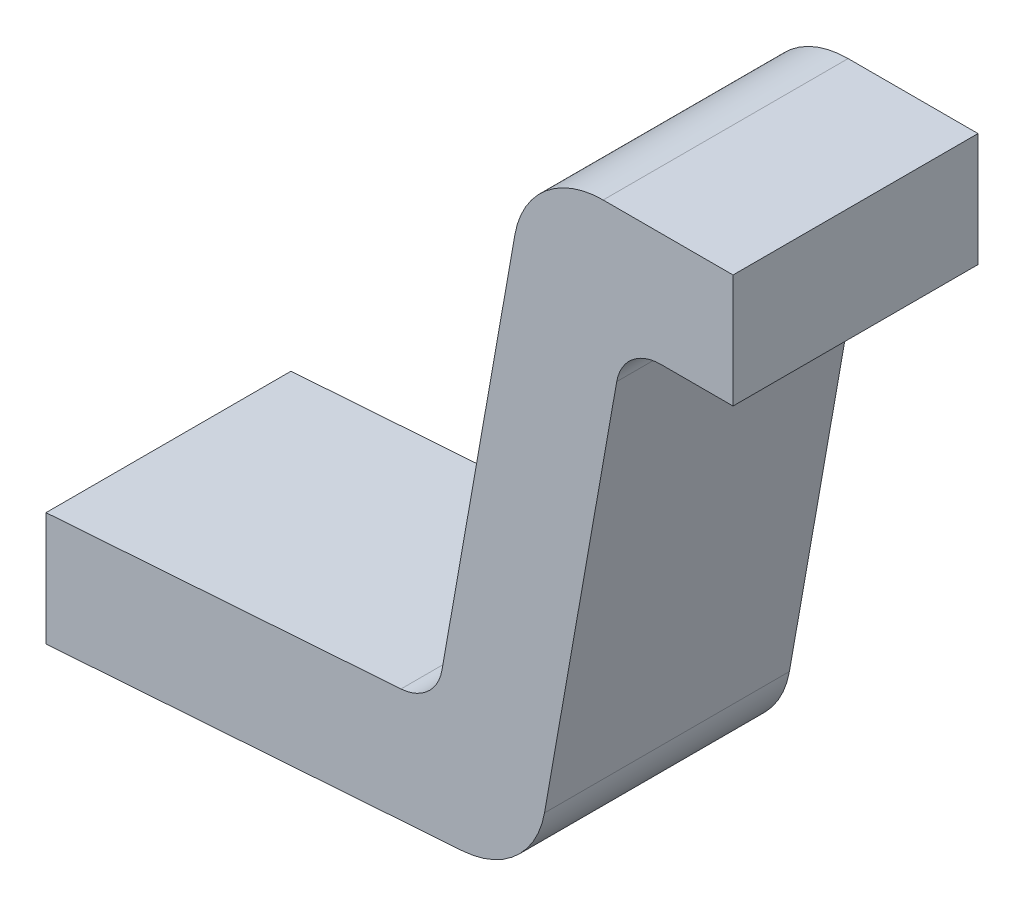
ISO-10303-21;
HEADER;
FILE_DESCRIPTION(('STEP AP214'),'2;1');
FILE_NAME('part.step','',(''),(''),'','','');
FILE_SCHEMA(('AUTOMOTIVE_DESIGN { 1 0 10303 214 1 1 1 1 }'));
ENDSEC;
DATA;
#1=APPLICATION_CONTEXT('core data for automotive mechanical design processes');
#2=APPLICATION_PROTOCOL_DEFINITION('international standard','automotive_design',2000,#1);
#3=PRODUCT_CONTEXT('',#1,'mechanical');
#4=PRODUCT('Part','Part','',(#3));
#5=PRODUCT_RELATED_PRODUCT_CATEGORY('part','',(#4));
#6=PRODUCT_DEFINITION_FORMATION('','',#4);
#7=PRODUCT_DEFINITION_CONTEXT('part definition',#1,'design');
#8=PRODUCT_DEFINITION('design','',#6,#7);
#9=PRODUCT_DEFINITION_SHAPE('','',#8);
#10=(LENGTH_UNIT() NAMED_UNIT(*) SI_UNIT(.MILLI.,.METRE.));
#11=(NAMED_UNIT(*) PLANE_ANGLE_UNIT() SI_UNIT($,.RADIAN.));
#12=(NAMED_UNIT(*) SI_UNIT($,.STERADIAN.) SOLID_ANGLE_UNIT());
#13=UNCERTAINTY_MEASURE_WITH_UNIT(LENGTH_MEASURE(1.E-05),#10,'distance_accuracy_value','');
#14=(GEOMETRIC_REPRESENTATION_CONTEXT(3) GLOBAL_UNCERTAINTY_ASSIGNED_CONTEXT((#13)) GLOBAL_UNIT_ASSIGNED_CONTEXT((#10,
#11,#12)) REPRESENTATION_CONTEXT('',''));
#15=CARTESIAN_POINT('',(0.,0.,0.));
#16=DIRECTION('',(0.,0.,1.));
#17=DIRECTION('',(1.,0.,0.));
#18=AXIS2_PLACEMENT_3D('',#15,#16,#17);
#19=CARTESIAN_POINT('',(0.657250080214,0.470646116994,0.41));
#20=DIRECTION('',(0.,0.,1.));
#21=DIRECTION('',(1.,0.,0.));
#22=AXIS2_PLACEMENT_3D('',#19,#20,#21);
#23=PLANE('',#22);
#24=CARTESIAN_POINT('',(0.68662916084,0.198380072917,0.41));
#25=DIRECTION('',(0.,0.,-1.));
#26=DIRECTION('',(0.669130606359133,-0.743144825477147,0.));
#27=AXIS2_PLACEMENT_3D('',#24,#25,#26);
#28=CIRCLE('',#27,0.15);
#29=CARTESIAN_POINT('',(0.834350323792,0.172332846267,0.41));
#30=VERTEX_POINT('',#29);
#31=CARTESIAN_POINT('',(0.697092631902,0.04874546537821,0.41));
#32=VERTEX_POINT('',#31);
#33=EDGE_CURVE('E226',#30,#32,#28,.T.);
#34=ORIENTED_EDGE('',*,*,#33,.F.);
#35=DIRECTION('',(0.173648177667033,0.98480775301219,0.));
#36=VECTOR('',#35,1.);
#37=CARTESIAN_POINT('',(0.814,0.05692042492202,0.41));
#38=LINE('',#37,#36);
#39=CARTESIAN_POINT('',(0.955256106447,0.858023613325,0.41));
#40=VERTEX_POINT('',#39);
#41=EDGE_CURVE('E236',#30,#40,#38,.T.);
#42=ORIENTED_EDGE('',*,*,#41,.T.);
#43=CARTESIAN_POINT('',(1.029116687923,0.845,0.41));
#44=DIRECTION('',(0.,0.,1.));
#45=DIRECTION('',(-0.642787609686799,0.76604444311876,0.));
#46=AXIS2_PLACEMENT_3D('',#43,#44,#45);
#47=CIRCLE('',#46,0.075);
#48=CARTESIAN_POINT('',(1.029116687923,0.92,0.41));
#49=VERTEX_POINT('',#48);
#50=EDGE_CURVE('E199',#49,#40,#47,.T.);
#51=ORIENTED_EDGE('',*,*,#50,.F.);
#52=DIRECTION('',(1.,0.,0.));
#53=VECTOR('',#52,1.);
#54=CARTESIAN_POINT('',(0.966184215585,0.92,0.41));
#55=LINE('',#54,#53);
#56=CARTESIAN_POINT('',(1.15,0.92,0.41));
#57=VERTEX_POINT('',#56);
#58=EDGE_CURVE('E180',#49,#57,#55,.T.);
#59=ORIENTED_EDGE('',*,*,#58,.T.);
#60=DIRECTION('',(0.,1.,0.));
#61=VECTOR('',#60,1.);
#62=CARTESIAN_POINT('',(1.15,0.92,0.41));
#63=LINE('',#62,#61);
#64=CARTESIAN_POINT('',(1.15,1.11,0.41));
#65=VERTEX_POINT('',#64);
#66=EDGE_CURVE('E48',#57,#65,#63,.T.);
#67=ORIENTED_EDGE('',*,*,#66,.T.);
#68=DIRECTION('',(-1.,0.,0.));
#69=VECTOR('',#68,1.);
#70=CARTESIAN_POINT('',(1.15,1.11,0.41));
#71=LINE('',#70,#69);
#72=CARTESIAN_POINT('',(0.932620230338,1.11,0.41));
#73=VERTEX_POINT('',#72);
#74=EDGE_CURVE('E145',#65,#73,#71,.T.);
#75=ORIENTED_EDGE('',*,*,#74,.T.);
#76=CARTESIAN_POINT('',(0.932620230338,0.96,0.41));
#77=DIRECTION('',(0.,0.,-1.));
#78=DIRECTION('',(-0.642787609686799,0.76604444311876,0.));
#79=AXIS2_PLACEMENT_3D('',#76,#77,#78);
#80=CIRCLE('',#79,0.15);
#81=CARTESIAN_POINT('',(0.784899067386,0.98604722665,0.41));
#82=VERTEX_POINT('',#81);
#83=EDGE_CURVE('E140',#82,#73,#80,.T.);
#84=ORIENTED_EDGE('',*,*,#83,.F.);
#85=DIRECTION('',(-0.173648177667033,-0.98480775301219,0.));
#86=VECTOR('',#85,1.);
#87=CARTESIAN_POINT('',(0.806755285661,1.11,0.41));
#88=LINE('',#87,#86);
#89=CARTESIAN_POINT('',(0.662838765627,0.293808856388,0.41));
#90=VERTEX_POINT('',#89);
#91=EDGE_CURVE('E11',#82,#90,#88,.T.);
#92=ORIENTED_EDGE('',*,*,#91,.T.);
#93=CARTESIAN_POINT('',(0.588978184151,0.306832469713,0.41));
#94=DIRECTION('',(0.,0.,1.));
#95=DIRECTION('',(0.669130606359133,-0.743144825477147,0.));
#96=AXIS2_PLACEMENT_3D('',#93,#94,#95);
#97=CIRCLE('',#96,0.075);
#98=CARTESIAN_POINT('',(0.594209919682,0.232015165944,0.41));
#99=VERTEX_POINT('',#98);
#100=EDGE_CURVE('E182',#99,#90,#97,.T.);
#101=ORIENTED_EDGE('',*,*,#100,.F.);
#102=DIRECTION('',(-0.997564050259825,-0.0697564737441177,0.));
#103=VECTOR('',#102,1.);
#104=CARTESIAN_POINT('',(0.652663603731,0.236102645716,0.41));
#105=LINE('',#104,#103);
#106=CARTESIAN_POINT('',(0.,0.190463960635,0.41));
#107=VERTEX_POINT('',#106);
#108=EDGE_CURVE('E225',#99,#107,#105,.T.);
#109=ORIENTED_EDGE('',*,*,#108,.T.);
#110=DIRECTION('',(0.,-1.,0.));
#111=VECTOR('',#110,1.);
#112=CARTESIAN_POINT('',(0.,0.190463960635,0.41));
#113=LINE('',#112,#111);
#114=CARTESIAN_POINT('',(0.,0.,0.41));
#115=VERTEX_POINT('',#114);
#116=EDGE_CURVE('E25',#107,#115,#113,.T.);
#117=ORIENTED_EDGE('',*,*,#116,.T.);
#118=DIRECTION('',(0.997564050259825,0.0697564737441177,0.));
#119=VECTOR('',#118,1.);
#120=CARTESIAN_POINT('',(0.,0.,0.41));
#121=LINE('',#120,#119);
#122=EDGE_CURVE('E248',#115,#32,#121,.T.);
#123=ORIENTED_EDGE('',*,*,#122,.T.);
#124=EDGE_LOOP('',(#34,#42,#51,#59,#67,#75,#84,#92,#101,#109,#117,#123));
#125=FACE_BOUND('',#124,.T.);
#126=ADVANCED_FACE('F16',(#125),#23,.T.);
#127=CARTESIAN_POINT('',(0.806755285661,1.11,0.));
#128=DIRECTION('',(-0.98480775301219,0.173648177667033,0.));
#129=DIRECTION('',(0.,0.,1.));
#130=AXIS2_PLACEMENT_3D('',#127,#128,#129);
#131=PLANE('',#130);
#132=DIRECTION('',(0.,0.,-1.));
#133=VECTOR('',#132,1.);
#134=CARTESIAN_POINT('',(0.662838765627,0.293808856388,0.));
#135=LINE('',#134,#133);
#136=CARTESIAN_POINT('',(0.662838765627,0.293808856388,0.));
#137=VERTEX_POINT('',#136);
#138=EDGE_CURVE('E133',#90,#137,#135,.T.);
#139=ORIENTED_EDGE('',*,*,#138,.F.);
#140=ORIENTED_EDGE('',*,*,#91,.F.);
#141=DIRECTION('',(0.,0.,1.));
#142=VECTOR('',#141,1.);
#143=CARTESIAN_POINT('',(0.784899067386,0.98604722665,0.));
#144=LINE('',#143,#142);
#145=CARTESIAN_POINT('',(0.784899067386,0.98604722665,0.));
#146=VERTEX_POINT('',#145);
#147=EDGE_CURVE('E130',#146,#82,#144,.T.);
#148=ORIENTED_EDGE('',*,*,#147,.F.);
#149=DIRECTION('',(-0.173648177667033,-0.98480775301219,0.));
#150=VECTOR('',#149,1.);
#151=CARTESIAN_POINT('',(0.806755285661,1.11,0.));
#152=LINE('',#151,#150);
#153=EDGE_CURVE('E166',#146,#137,#152,.T.);
#154=ORIENTED_EDGE('',*,*,#153,.T.);
#155=EDGE_LOOP('',(#139,#140,#148,#154));
#156=FACE_BOUND('',#155,.T.);
#157=ADVANCED_FACE('F18',(#156),#131,.T.);
#158=CARTESIAN_POINT('',(0.,0.190463960635,0.));
#159=DIRECTION('',(-1.,0.,0.));
#160=DIRECTION('',(0.,1.,0.));
#161=AXIS2_PLACEMENT_3D('',#158,#159,#160);
#162=PLANE('',#161);
#163=DIRECTION('',(0.,-1.,0.));
#164=VECTOR('',#163,1.);
#165=CARTESIAN_POINT('',(0.,0.190463960635,0.));
#166=LINE('',#165,#164);
#167=CARTESIAN_POINT('',(0.,0.190463960635,0.));
#168=VERTEX_POINT('',#167);
#169=CARTESIAN_POINT('',(0.,0.,0.));
#170=VERTEX_POINT('',#169);
#171=EDGE_CURVE('E169',#168,#170,#166,.T.);
#172=ORIENTED_EDGE('',*,*,#171,.T.);
#173=DIRECTION('',(0.,0.,1.));
#174=VECTOR('',#173,1.);
#175=CARTESIAN_POINT('',(0.,0.,0.));
#176=LINE('',#175,#174);
#177=EDGE_CURVE('E175',#170,#115,#176,.T.);
#178=ORIENTED_EDGE('',*,*,#177,.T.);
#179=ORIENTED_EDGE('',*,*,#116,.F.);
#180=DIRECTION('',(0.,0.,1.));
#181=VECTOR('',#180,1.);
#182=CARTESIAN_POINT('',(0.,0.190463960635,0.));
#183=LINE('',#182,#181);
#184=EDGE_CURVE('E221',#168,#107,#183,.T.);
#185=ORIENTED_EDGE('',*,*,#184,.F.);
#186=EDGE_LOOP('',(#172,#178,#179,#185));
#187=FACE_BOUND('',#186,.T.);
#188=ADVANCED_FACE('F461',(#187),#162,.T.);
#189=CARTESIAN_POINT('',(0.,0.,0.));
#190=DIRECTION('',(0.0697564737441177,-0.997564050259825,0.));
#191=DIRECTION('',(0.,0.,-1.));
#192=AXIS2_PLACEMENT_3D('',#189,#190,#191);
#193=PLANE('',#192);
#194=DIRECTION('',(0.,0.,-1.));
#195=VECTOR('',#194,1.);
#196=CARTESIAN_POINT('',(0.697092631902,0.04874546537821,0.));
#197=LINE('',#196,#195);
#198=CARTESIAN_POINT('',(0.697092631902,0.04874546537821,0.));
#199=VERTEX_POINT('',#198);
#200=EDGE_CURVE('E230',#32,#199,#197,.T.);
#201=ORIENTED_EDGE('',*,*,#200,.F.);
#202=ORIENTED_EDGE('',*,*,#122,.F.);
#203=ORIENTED_EDGE('',*,*,#177,.F.);
#204=DIRECTION('',(0.997564050259825,0.0697564737441177,0.));
#205=VECTOR('',#204,1.);
#206=CARTESIAN_POINT('',(0.,0.,0.));
#207=LINE('',#206,#205);
#208=EDGE_CURVE('E193',#170,#199,#207,.T.);
#209=ORIENTED_EDGE('',*,*,#208,.T.);
#210=EDGE_LOOP('',(#201,#202,#203,#209));
#211=FACE_BOUND('',#210,.T.);
#212=ADVANCED_FACE('F262',(#211),#193,.T.);
#213=CARTESIAN_POINT('',(1.15,0.92,0.));
#214=DIRECTION('',(1.,0.,0.));
#215=DIRECTION('',(0.,1.,0.));
#216=AXIS2_PLACEMENT_3D('',#213,#214,#215);
#217=PLANE('',#216);
#218=DIRECTION('',(0.,1.,0.));
#219=VECTOR('',#218,1.);
#220=CARTESIAN_POINT('',(1.15,0.92,0.));
#221=LINE('',#220,#219);
#222=CARTESIAN_POINT('',(1.15,0.92,0.));
#223=VERTEX_POINT('',#222);
#224=CARTESIAN_POINT('',(1.15,1.11,0.));
#225=VERTEX_POINT('',#224);
#226=EDGE_CURVE('E152',#223,#225,#221,.T.);
#227=ORIENTED_EDGE('',*,*,#226,.T.);
#228=DIRECTION('',(0.,0.,1.));
#229=VECTOR('',#228,1.);
#230=CARTESIAN_POINT('',(1.15,1.11,0.));
#231=LINE('',#230,#229);
#232=EDGE_CURVE('E170',#225,#65,#231,.T.);
#233=ORIENTED_EDGE('',*,*,#232,.T.);
#234=ORIENTED_EDGE('',*,*,#66,.F.);
#235=DIRECTION('',(0.,0.,1.));
#236=VECTOR('',#235,1.);
#237=CARTESIAN_POINT('',(1.15,0.92,0.));
#238=LINE('',#237,#236);
#239=EDGE_CURVE('E208',#223,#57,#238,.T.);
#240=ORIENTED_EDGE('',*,*,#239,.F.);
#241=EDGE_LOOP('',(#227,#233,#234,#240));
#242=FACE_BOUND('',#241,.T.);
#243=ADVANCED_FACE('F299',(#242),#217,.T.);
#244=CARTESIAN_POINT('',(1.15,1.11,0.));
#245=DIRECTION('',(0.,1.,0.));
#246=DIRECTION('',(1.,0.,0.));
#247=AXIS2_PLACEMENT_3D('',#244,#245,#246);
#248=PLANE('',#247);
#249=DIRECTION('',(0.,0.,-1.));
#250=VECTOR('',#249,1.);
#251=CARTESIAN_POINT('',(0.932620230338,1.11,0.));
#252=LINE('',#251,#250);
#253=CARTESIAN_POINT('',(0.932620230338,1.11,0.));
#254=VERTEX_POINT('',#253);
#255=EDGE_CURVE('E146',#73,#254,#252,.T.);
#256=ORIENTED_EDGE('',*,*,#255,.F.);
#257=ORIENTED_EDGE('',*,*,#74,.F.);
#258=ORIENTED_EDGE('',*,*,#232,.F.);
#259=DIRECTION('',(-1.,0.,0.));
#260=VECTOR('',#259,1.);
#261=CARTESIAN_POINT('',(1.15,1.11,0.));
#262=LINE('',#261,#260);
#263=EDGE_CURVE('E161',#225,#254,#262,.T.);
#264=ORIENTED_EDGE('',*,*,#263,.T.);
#265=EDGE_LOOP('',(#256,#257,#258,#264));
#266=FACE_BOUND('',#265,.T.);
#267=ADVANCED_FACE('F418',(#266),#248,.T.);
#268=CARTESIAN_POINT('',(0.932620230338,0.96,0.));
#269=DIRECTION('',(0.,0.,1.));
#270=DIRECTION('',(-0.642787609686799,0.76604444311876,0.));
#271=AXIS2_PLACEMENT_3D('',#268,#269,#270);
#272=CYLINDRICAL_SURFACE('',#271,0.15);
#273=ORIENTED_EDGE('',*,*,#83,.T.);
#274=ORIENTED_EDGE('',*,*,#255,.T.);
#275=CARTESIAN_POINT('',(0.932620230338,0.96,0.));
#276=DIRECTION('',(0.,0.,1.));
#277=DIRECTION('',(-0.642787609686799,0.76604444311876,0.));
#278=AXIS2_PLACEMENT_3D('',#275,#276,#277);
#279=CIRCLE('',#278,0.15);
#280=EDGE_CURVE('E142',#254,#146,#279,.T.);
#281=ORIENTED_EDGE('',*,*,#280,.T.);
#282=ORIENTED_EDGE('',*,*,#147,.T.);
#283=EDGE_LOOP('',(#273,#274,#281,#282));
#284=FACE_BOUND('',#283,.T.);
#285=ADVANCED_FACE('F139',(#284),#272,.T.);
#286=CARTESIAN_POINT('',(0.657250080214,0.470646116994,0.));
#287=DIRECTION('',(0.,0.,1.));
#288=DIRECTION('',(1.,0.,0.));
#289=AXIS2_PLACEMENT_3D('',#286,#287,#288);
#290=PLANE('',#289);
#291=CARTESIAN_POINT('',(0.68662916084,0.198380072917,0.));
#292=DIRECTION('',(0.,0.,1.));
#293=DIRECTION('',(0.669130606359133,-0.743144825477147,0.));
#294=AXIS2_PLACEMENT_3D('',#291,#292,#293);
#295=CIRCLE('',#294,0.15);
#296=CARTESIAN_POINT('',(0.834350323792,0.172332846267,0.));
#297=VERTEX_POINT('',#296);
#298=EDGE_CURVE('E231',#199,#297,#295,.T.);
#299=ORIENTED_EDGE('',*,*,#298,.F.);
#300=ORIENTED_EDGE('',*,*,#208,.F.);
#301=ORIENTED_EDGE('',*,*,#171,.F.);
#302=DIRECTION('',(-0.997564050259825,-0.0697564737441177,0.));
#303=VECTOR('',#302,1.);
#304=CARTESIAN_POINT('',(0.652663603731,0.236102645716,0.));
#305=LINE('',#304,#303);
#306=CARTESIAN_POINT('',(0.594209919682,0.232015165944,0.));
#307=VERTEX_POINT('',#306);
#308=EDGE_CURVE('E220',#307,#168,#305,.T.);
#309=ORIENTED_EDGE('',*,*,#308,.F.);
#310=CARTESIAN_POINT('',(0.588978184151,0.306832469713,0.));
#311=DIRECTION('',(0.,0.,-1.));
#312=DIRECTION('',(0.669130606359133,-0.743144825477147,0.));
#313=AXIS2_PLACEMENT_3D('',#310,#311,#312);
#314=CIRCLE('',#313,0.075);
#315=EDGE_CURVE('E176',#137,#307,#314,.T.);
#316=ORIENTED_EDGE('',*,*,#315,.F.);
#317=ORIENTED_EDGE('',*,*,#153,.F.);
#318=ORIENTED_EDGE('',*,*,#280,.F.);
#319=ORIENTED_EDGE('',*,*,#263,.F.);
#320=ORIENTED_EDGE('',*,*,#226,.F.);
#321=DIRECTION('',(1.,0.,0.));
#322=VECTOR('',#321,1.);
#323=CARTESIAN_POINT('',(0.966184215585,0.92,0.));
#324=LINE('',#323,#322);
#325=CARTESIAN_POINT('',(1.029116687923,0.92,0.));
#326=VERTEX_POINT('',#325);
#327=EDGE_CURVE('E212',#326,#223,#324,.T.);
#328=ORIENTED_EDGE('',*,*,#327,.F.);
#329=CARTESIAN_POINT('',(1.029116687923,0.845,0.));
#330=DIRECTION('',(0.,0.,-1.));
#331=DIRECTION('',(-0.642787609686799,0.76604444311876,0.));
#332=AXIS2_PLACEMENT_3D('',#329,#330,#331);
#333=CIRCLE('',#332,0.075);
#334=CARTESIAN_POINT('',(0.955256106447,0.858023613325,0.));
#335=VERTEX_POINT('',#334);
#336=EDGE_CURVE('E185',#335,#326,#333,.T.);
#337=ORIENTED_EDGE('',*,*,#336,.F.);
#338=DIRECTION('',(0.173648177667033,0.98480775301219,0.));
#339=VECTOR('',#338,1.);
#340=CARTESIAN_POINT('',(0.814,0.05692042492202,0.));
#341=LINE('',#340,#339);
#342=EDGE_CURVE('E240',#297,#335,#341,.T.);
#343=ORIENTED_EDGE('',*,*,#342,.F.);
#344=EDGE_LOOP('',(#299,#300,#301,#309,#316,#317,#318,#319,#320,#328,#337,#343));
#345=FACE_BOUND('',#344,.T.);
#346=ADVANCED_FACE('F267',(#345),#290,.F.);
#347=CARTESIAN_POINT('',(0.814,0.05692042492202,0.));
#348=DIRECTION('',(0.98480775301219,-0.173648177667033,0.));
#349=DIRECTION('',(0.,0.,-1.));
#350=AXIS2_PLACEMENT_3D('',#347,#348,#349);
#351=PLANE('',#350);
#352=DIRECTION('',(0.,0.,-1.));
#353=VECTOR('',#352,1.);
#354=CARTESIAN_POINT('',(0.955256106447,0.858023613325,0.));
#355=LINE('',#354,#353);
#356=EDGE_CURVE('E163',#40,#335,#355,.T.);
#357=ORIENTED_EDGE('',*,*,#356,.F.);
#358=ORIENTED_EDGE('',*,*,#41,.F.);
#359=DIRECTION('',(0.,0.,1.));
#360=VECTOR('',#359,1.);
#361=CARTESIAN_POINT('',(0.834350323792,0.172332846267,0.));
#362=LINE('',#361,#360);
#363=EDGE_CURVE('E235',#297,#30,#362,.T.);
#364=ORIENTED_EDGE('',*,*,#363,.F.);
#365=ORIENTED_EDGE('',*,*,#342,.T.);
#366=EDGE_LOOP('',(#357,#358,#364,#365));
#367=FACE_BOUND('',#366,.T.);
#368=ADVANCED_FACE('F273',(#367),#351,.T.);
#369=CARTESIAN_POINT('',(0.68662916084,0.198380072917,0.));
#370=DIRECTION('',(0.,0.,1.));
#371=DIRECTION('',(0.669130606359133,-0.743144825477147,0.));
#372=AXIS2_PLACEMENT_3D('',#369,#370,#371);
#373=CYLINDRICAL_SURFACE('',#372,0.15);
#374=ORIENTED_EDGE('',*,*,#33,.T.);
#375=ORIENTED_EDGE('',*,*,#200,.T.);
#376=ORIENTED_EDGE('',*,*,#298,.T.);
#377=ORIENTED_EDGE('',*,*,#363,.T.);
#378=EDGE_LOOP('',(#374,#375,#376,#377));
#379=FACE_BOUND('',#378,.T.);
#380=ADVANCED_FACE('F257',(#379),#373,.T.);
#381=CARTESIAN_POINT('',(0.652663603731,0.236102645716,0.));
#382=DIRECTION('',(-0.0697564737441177,0.997564050259825,0.));
#383=DIRECTION('',(0.,0.,1.));
#384=AXIS2_PLACEMENT_3D('',#381,#382,#383);
#385=PLANE('',#384);
#386=DIRECTION('',(0.,0.,1.));
#387=VECTOR('',#386,1.);
#388=CARTESIAN_POINT('',(0.594209919682,0.232015165944,0.));
#389=LINE('',#388,#387);
#390=EDGE_CURVE('E179',#307,#99,#389,.T.);
#391=ORIENTED_EDGE('',*,*,#390,.F.);
#392=ORIENTED_EDGE('',*,*,#308,.T.);
#393=ORIENTED_EDGE('',*,*,#184,.T.);
#394=ORIENTED_EDGE('',*,*,#108,.F.);
#395=EDGE_LOOP('',(#391,#392,#393,#394));
#396=FACE_BOUND('',#395,.T.);
#397=ADVANCED_FACE('F408',(#396),#385,.T.);
#398=CARTESIAN_POINT('',(0.588978184151,0.306832469713,0.));
#399=DIRECTION('',(0.,0.,1.));
#400=DIRECTION('',(0.669130606359133,-0.743144825477147,0.));
#401=AXIS2_PLACEMENT_3D('',#398,#399,#400);
#402=CYLINDRICAL_SURFACE('',#401,0.075);
#403=ORIENTED_EDGE('',*,*,#315,.T.);
#404=ORIENTED_EDGE('',*,*,#390,.T.);
#405=ORIENTED_EDGE('',*,*,#100,.T.);
#406=ORIENTED_EDGE('',*,*,#138,.T.);
#407=EDGE_LOOP('',(#403,#404,#405,#406));
#408=FACE_BOUND('',#407,.T.);
#409=ADVANCED_FACE('F400',(#408),#402,.F.);
#410=CARTESIAN_POINT('',(0.966184215585,0.92,0.));
#411=DIRECTION('',(0.,-1.,0.));
#412=DIRECTION('',(0.,0.,-1.));
#413=AXIS2_PLACEMENT_3D('',#410,#411,#412);
#414=PLANE('',#413);
#415=DIRECTION('',(0.,0.,1.));
#416=VECTOR('',#415,1.);
#417=CARTESIAN_POINT('',(1.029116687923,0.92,0.));
#418=LINE('',#417,#416);
#419=EDGE_CURVE('E189',#326,#49,#418,.T.);
#420=ORIENTED_EDGE('',*,*,#419,.F.);
#421=ORIENTED_EDGE('',*,*,#327,.T.);
#422=ORIENTED_EDGE('',*,*,#239,.T.);
#423=ORIENTED_EDGE('',*,*,#58,.F.);
#424=EDGE_LOOP('',(#420,#421,#422,#423));
#425=FACE_BOUND('',#424,.T.);
#426=ADVANCED_FACE('F296',(#425),#414,.T.);
#427=CARTESIAN_POINT('',(1.029116687923,0.845,0.));
#428=DIRECTION('',(0.,0.,1.));
#429=DIRECTION('',(-0.642787609686799,0.76604444311876,0.));
#430=AXIS2_PLACEMENT_3D('',#427,#428,#429);
#431=CYLINDRICAL_SURFACE('',#430,0.075);
#432=ORIENTED_EDGE('',*,*,#336,.T.);
#433=ORIENTED_EDGE('',*,*,#419,.T.);
#434=ORIENTED_EDGE('',*,*,#50,.T.);
#435=ORIENTED_EDGE('',*,*,#356,.T.);
#436=EDGE_LOOP('',(#432,#433,#434,#435));
#437=FACE_BOUND('',#436,.T.);
#438=ADVANCED_FACE('F290',(#437),#431,.F.);
#439=CLOSED_SHELL('',(#126,#157,#188,#212,#243,#267,#285,#346,#368,#380,#397,#409,#426,#438));
#440=MANIFOLD_SOLID_BREP('B1',#439);
#441=ADVANCED_BREP_SHAPE_REPRESENTATION('',(#18,#440),#14);
#442=SHAPE_DEFINITION_REPRESENTATION(#9,#441);
ENDSEC;
END-ISO-10303-21;
